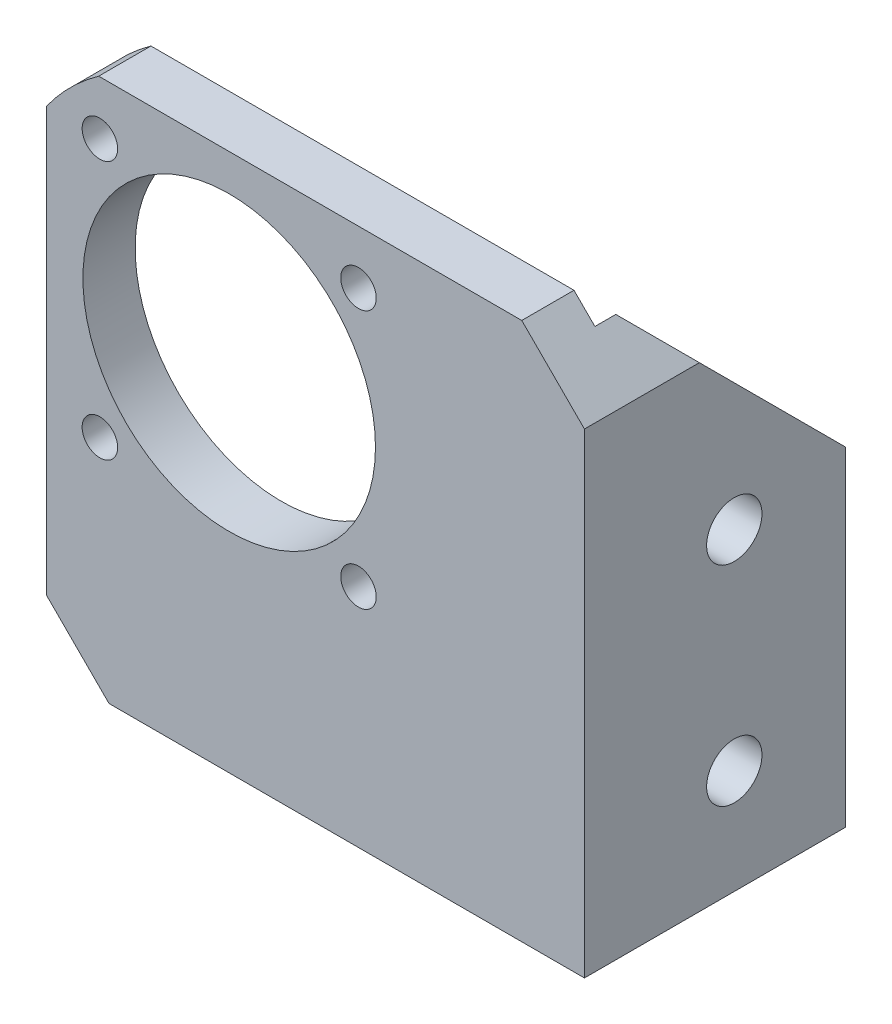
ISO-10303-21;
HEADER;
FILE_DESCRIPTION(('STEP AP214'),'2;1');
FILE_NAME('part.step','',(''),(''),'','','');
FILE_SCHEMA(('AUTOMOTIVE_DESIGN { 1 0 10303 214 1 1 1 1 }'));
ENDSEC;
DATA;
#1=APPLICATION_CONTEXT('core data for automotive mechanical design processes');
#2=APPLICATION_PROTOCOL_DEFINITION('international standard','automotive_design',2000,#1);
#3=PRODUCT_CONTEXT('',#1,'mechanical');
#4=PRODUCT('Part','Part','',(#3));
#5=PRODUCT_RELATED_PRODUCT_CATEGORY('part','',(#4));
#6=PRODUCT_DEFINITION_FORMATION('','',#4);
#7=PRODUCT_DEFINITION_CONTEXT('part definition',#1,'design');
#8=PRODUCT_DEFINITION('design','',#6,#7);
#9=PRODUCT_DEFINITION_SHAPE('','',#8);
#10=(LENGTH_UNIT() NAMED_UNIT(*) SI_UNIT(.MILLI.,.METRE.));
#11=(NAMED_UNIT(*) PLANE_ANGLE_UNIT() SI_UNIT($,.RADIAN.));
#12=(NAMED_UNIT(*) SI_UNIT($,.STERADIAN.) SOLID_ANGLE_UNIT());
#13=UNCERTAINTY_MEASURE_WITH_UNIT(LENGTH_MEASURE(1.E-05),#10,'distance_accuracy_value','');
#14=(GEOMETRIC_REPRESENTATION_CONTEXT(3) GLOBAL_UNCERTAINTY_ASSIGNED_CONTEXT((#13)) GLOBAL_UNIT_ASSIGNED_CONTEXT((#10,
#11,#12)) REPRESENTATION_CONTEXT('',''));
#15=CARTESIAN_POINT('',(0.,0.,0.));
#16=DIRECTION('',(0.,0.,1.));
#17=DIRECTION('',(1.,0.,0.));
#18=AXIS2_PLACEMENT_3D('',#15,#16,#17);
#19=CARTESIAN_POINT('',(0.,0.,0.));
#20=DIRECTION('',(0.,0.,1.));
#21=DIRECTION('',(1.,0.,0.));
#22=AXIS2_PLACEMENT_3D('',#19,#20,#21);
#23=PLANE('',#22);
#24=CARTESIAN_POINT('',(-12.374368670765,12.374368670765,0.));
#25=DIRECTION('',(0.,0.,1.));
#26=DIRECTION('',(1.,0.,0.));
#27=AXIS2_PLACEMENT_3D('',#24,#25,#26);
#28=CIRCLE('',#27,1.70000000000001);
#29=CARTESIAN_POINT('',(-10.674368670765,12.374368670765,0.));
#30=VERTEX_POINT('',#29);
#31=EDGE_CURVE('E142',#30,#30,#28,.T.);
#32=ORIENTED_EDGE('',*,*,#31,.T.);
#33=EDGE_LOOP('',(#32));
#34=FACE_BOUND('',#33,.T.);
#35=CARTESIAN_POINT('',(12.374368670765,12.374368670765,0.));
#36=DIRECTION('',(0.,0.,1.));
#37=DIRECTION('',(1.,0.,0.));
#38=AXIS2_PLACEMENT_3D('',#35,#36,#37);
#39=CIRCLE('',#38,1.70000000000001);
#40=CARTESIAN_POINT('',(14.074368670765,12.374368670765,0.));
#41=VERTEX_POINT('',#40);
#42=EDGE_CURVE('E167',#41,#41,#39,.T.);
#43=ORIENTED_EDGE('',*,*,#42,.T.);
#44=EDGE_LOOP('',(#43));
#45=FACE_BOUND('',#44,.T.);
#46=CARTESIAN_POINT('',(12.374368670765,-12.374368670765,0.));
#47=DIRECTION('',(0.,0.,1.));
#48=DIRECTION('',(1.,0.,0.));
#49=AXIS2_PLACEMENT_3D('',#46,#47,#48);
#50=CIRCLE('',#49,1.70000000000001);
#51=CARTESIAN_POINT('',(14.074368670765,-12.374368670765,0.));
#52=VERTEX_POINT('',#51);
#53=EDGE_CURVE('E173',#52,#52,#50,.T.);
#54=ORIENTED_EDGE('',*,*,#53,.T.);
#55=EDGE_LOOP('',(#54));
#56=FACE_BOUND('',#55,.T.);
#57=CARTESIAN_POINT('',(-12.374368670765,-12.374368670765,0.));
#58=DIRECTION('',(0.,0.,1.));
#59=DIRECTION('',(1.,0.,0.));
#60=AXIS2_PLACEMENT_3D('',#57,#58,#59);
#61=CIRCLE('',#60,1.70000000000001);
#62=CARTESIAN_POINT('',(-10.674368670765,-12.374368670765,0.));
#63=VERTEX_POINT('',#62);
#64=EDGE_CURVE('E179',#63,#63,#61,.T.);
#65=ORIENTED_EDGE('',*,*,#64,.T.);
#66=EDGE_LOOP('',(#65));
#67=FACE_BOUND('',#66,.T.);
#68=CARTESIAN_POINT('',(0.,0.,0.));
#69=DIRECTION('',(0.,0.,1.));
#70=DIRECTION('',(1.,0.,0.));
#71=AXIS2_PLACEMENT_3D('',#68,#69,#70);
#72=CIRCLE('',#71,14.);
#73=CARTESIAN_POINT('',(14.,0.,0.));
#74=VERTEX_POINT('',#73);
#75=EDGE_CURVE('E185',#74,#74,#72,.T.);
#76=ORIENTED_EDGE('',*,*,#75,.T.);
#77=EDGE_LOOP('',(#76));
#78=FACE_BOUND('',#77,.T.);
#79=DIRECTION('',(1.,0.,0.));
#80=VECTOR('',#79,1.);
#81=CARTESIAN_POINT('',(-17.5,-30.,0.));
#82=LINE('',#81,#80);
#83=CARTESIAN_POINT('',(-15.5,-30.,0.));
#84=VERTEX_POINT('',#83);
#85=CARTESIAN_POINT('',(30.0000000000018,-30.,0.));
#86=VERTEX_POINT('',#85);
#87=EDGE_CURVE('E155',#84,#86,#82,.T.);
#88=ORIENTED_EDGE('',*,*,#87,.F.);
#89=DIRECTION('',(-0.707106781186552,0.707106781186543,0.));
#90=VECTOR('',#89,1.);
#91=CARTESIAN_POINT('',(-17.5,-28.,0.));
#92=LINE('',#91,#90);
#93=CARTESIAN_POINT('',(-17.5,-28.,0.));
#94=VERTEX_POINT('',#93);
#95=EDGE_CURVE('E239',#84,#94,#92,.T.);
#96=ORIENTED_EDGE('',*,*,#95,.T.);
#97=DIRECTION('',(0.,-1.,0.));
#98=VECTOR('',#97,1.);
#99=CARTESIAN_POINT('',(-17.5,12.4899959967968,0.));
#100=LINE('',#99,#98);
#101=CARTESIAN_POINT('',(-17.5,12.4899959967968,0.));
#102=VERTEX_POINT('',#101);
#103=EDGE_CURVE('E197',#102,#94,#100,.T.);
#104=ORIENTED_EDGE('',*,*,#103,.F.);
#105=CARTESIAN_POINT('',(0.,0.,0.));
#106=DIRECTION('',(0.,0.,1.));
#107=DIRECTION('',(1.,0.,0.));
#108=AXIS2_PLACEMENT_3D('',#105,#106,#107);
#109=CIRCLE('',#108,21.5);
#110=CARTESIAN_POINT('',(-12.4899959967968,17.5,0.));
#111=VERTEX_POINT('',#110);
#112=EDGE_CURVE('E204',#111,#102,#109,.T.);
#113=ORIENTED_EDGE('',*,*,#112,.F.);
#114=DIRECTION('',(-1.,0.,0.));
#115=VECTOR('',#114,1.);
#116=CARTESIAN_POINT('',(12.4899959967968,17.5,0.));
#117=LINE('',#116,#115);
#118=CARTESIAN_POINT('',(28.0000000000018,17.5,0.));
#119=VERTEX_POINT('',#118);
#120=EDGE_CURVE('E191',#119,#111,#117,.T.);
#121=ORIENTED_EDGE('',*,*,#120,.F.);
#122=DIRECTION('',(0.707106781186549,-0.707106781186546,0.));
#123=VECTOR('',#122,1.);
#124=CARTESIAN_POINT('',(34.0000000000018,11.5,0.));
#125=LINE('',#124,#123);
#126=CARTESIAN_POINT('',(30.0000000000018,15.5,0.));
#127=VERTEX_POINT('',#126);
#128=EDGE_CURVE('E237',#119,#127,#125,.T.);
#129=ORIENTED_EDGE('',*,*,#128,.T.);
#130=DIRECTION('',(0.,1.,0.));
#131=VECTOR('',#130,1.);
#132=CARTESIAN_POINT('',(30.0000000000018,-30.,0.));
#133=LINE('',#132,#131);
#134=EDGE_CURVE('E131',#86,#127,#133,.T.);
#135=ORIENTED_EDGE('',*,*,#134,.F.);
#136=EDGE_LOOP('',(#88,#96,#104,#113,#121,#129,#135));
#137=FACE_BOUND('',#136,.T.);
#138=ADVANCED_FACE('F32',(#34,#45,#56,#67,#78,#137),#23,.F.);
#139=CARTESIAN_POINT('',(0.,0.,5.));
#140=DIRECTION('',(0.,0.,1.));
#141=DIRECTION('',(1.,0.,0.));
#142=AXIS2_PLACEMENT_3D('',#139,#140,#141);
#143=PLANE('',#142);
#144=DIRECTION('',(0.,-1.,0.));
#145=VECTOR('',#144,1.);
#146=CARTESIAN_POINT('',(-17.5,12.4899959967968,5.));
#147=LINE('',#146,#145);
#148=CARTESIAN_POINT('',(-17.5,12.4899959967968,5.));
#149=VERTEX_POINT('',#148);
#150=CARTESIAN_POINT('',(-17.5,-28.,5.));
#151=VERTEX_POINT('',#150);
#152=EDGE_CURVE('E199',#149,#151,#147,.T.);
#153=ORIENTED_EDGE('',*,*,#152,.T.);
#154=DIRECTION('',(0.707106781186552,-0.707106781186543,0.));
#155=VECTOR('',#154,1.);
#156=CARTESIAN_POINT('',(-22.7499999999999,-22.7500000000002,5.));
#157=LINE('',#156,#155);
#158=CARTESIAN_POINT('',(-11.5,-34.,5.));
#159=VERTEX_POINT('',#158);
#160=EDGE_CURVE('E229',#151,#159,#157,.T.);
#161=ORIENTED_EDGE('',*,*,#160,.T.);
#162=DIRECTION('',(1.,0.,0.));
#163=VECTOR('',#162,1.);
#164=CARTESIAN_POINT('',(-17.5,-34.,5.));
#165=LINE('',#164,#163);
#166=CARTESIAN_POINT('',(34.0000000000018,-33.9999999999998,5.));
#167=VERTEX_POINT('',#166);
#168=EDGE_CURVE('E161',#159,#167,#165,.T.);
#169=ORIENTED_EDGE('',*,*,#168,.T.);
#170=DIRECTION('',(0.,1.,0.));
#171=VECTOR('',#170,1.);
#172=CARTESIAN_POINT('',(34.0000000000018,-33.9999999999998,5.));
#173=LINE('',#172,#171);
#174=CARTESIAN_POINT('',(34.0000000000018,11.5,5.));
#175=VERTEX_POINT('',#174);
#176=EDGE_CURVE('E139',#167,#175,#173,.T.);
#177=ORIENTED_EDGE('',*,*,#176,.T.);
#178=DIRECTION('',(-0.707106781186549,0.707106781186546,0.));
#179=VECTOR('',#178,1.);
#180=CARTESIAN_POINT('',(22.7500000000009,22.7500000000009,5.));
#181=LINE('',#180,#179);
#182=CARTESIAN_POINT('',(28.0000000000018,17.5,5.));
#183=VERTEX_POINT('',#182);
#184=EDGE_CURVE('E227',#175,#183,#181,.T.);
#185=ORIENTED_EDGE('',*,*,#184,.T.);
#186=DIRECTION('',(-1.,0.,0.));
#187=VECTOR('',#186,1.);
#188=CARTESIAN_POINT('',(12.4899959967968,17.5,5.));
#189=LINE('',#188,#187);
#190=CARTESIAN_POINT('',(-12.4899959967968,17.5,5.));
#191=VERTEX_POINT('',#190);
#192=EDGE_CURVE('E194',#183,#191,#189,.T.);
#193=ORIENTED_EDGE('',*,*,#192,.T.);
#194=CARTESIAN_POINT('',(0.,0.,5.));
#195=DIRECTION('',(0.,0.,1.));
#196=DIRECTION('',(1.,0.,0.));
#197=AXIS2_PLACEMENT_3D('',#194,#195,#196);
#198=CIRCLE('',#197,21.5);
#199=EDGE_CURVE('E196',#191,#149,#198,.T.);
#200=ORIENTED_EDGE('',*,*,#199,.T.);
#201=EDGE_LOOP('',(#153,#161,#169,#177,#185,#193,#200));
#202=FACE_BOUND('',#201,.T.);
#203=CARTESIAN_POINT('',(12.374368670765,12.374368670765,5.));
#204=DIRECTION('',(0.,0.,1.));
#205=DIRECTION('',(1.,0.,0.));
#206=AXIS2_PLACEMENT_3D('',#203,#204,#205);
#207=CIRCLE('',#206,1.70000000000001);
#208=CARTESIAN_POINT('',(14.074368670765,12.374368670765,5.));
#209=VERTEX_POINT('',#208);
#210=EDGE_CURVE('E170',#209,#209,#207,.T.);
#211=ORIENTED_EDGE('',*,*,#210,.F.);
#212=EDGE_LOOP('',(#211));
#213=FACE_BOUND('',#212,.T.);
#214=CARTESIAN_POINT('',(-12.374368670765,-12.374368670765,5.));
#215=DIRECTION('',(0.,0.,1.));
#216=DIRECTION('',(1.,0.,0.));
#217=AXIS2_PLACEMENT_3D('',#214,#215,#216);
#218=CIRCLE('',#217,1.70000000000001);
#219=CARTESIAN_POINT('',(-10.674368670765,-12.374368670765,5.));
#220=VERTEX_POINT('',#219);
#221=EDGE_CURVE('E182',#220,#220,#218,.T.);
#222=ORIENTED_EDGE('',*,*,#221,.F.);
#223=EDGE_LOOP('',(#222));
#224=FACE_BOUND('',#223,.T.);
#225=CARTESIAN_POINT('',(0.,0.,5.));
#226=DIRECTION('',(0.,0.,1.));
#227=DIRECTION('',(1.,0.,0.));
#228=AXIS2_PLACEMENT_3D('',#225,#226,#227);
#229=CIRCLE('',#228,14.);
#230=CARTESIAN_POINT('',(14.,0.,5.));
#231=VERTEX_POINT('',#230);
#232=EDGE_CURVE('E188',#231,#231,#229,.T.);
#233=ORIENTED_EDGE('',*,*,#232,.F.);
#234=EDGE_LOOP('',(#233));
#235=FACE_BOUND('',#234,.T.);
#236=CARTESIAN_POINT('',(12.374368670765,-12.374368670765,5.));
#237=DIRECTION('',(0.,0.,1.));
#238=DIRECTION('',(1.,0.,0.));
#239=AXIS2_PLACEMENT_3D('',#236,#237,#238);
#240=CIRCLE('',#239,1.70000000000001);
#241=CARTESIAN_POINT('',(14.074368670765,-12.374368670765,5.));
#242=VERTEX_POINT('',#241);
#243=EDGE_CURVE('E176',#242,#242,#240,.T.);
#244=ORIENTED_EDGE('',*,*,#243,.F.);
#245=EDGE_LOOP('',(#244));
#246=FACE_BOUND('',#245,.T.);
#247=CARTESIAN_POINT('',(-12.374368670765,12.374368670765,5.));
#248=DIRECTION('',(0.,0.,1.));
#249=DIRECTION('',(1.,0.,0.));
#250=AXIS2_PLACEMENT_3D('',#247,#248,#249);
#251=CIRCLE('',#250,1.70000000000001);
#252=CARTESIAN_POINT('',(-10.674368670765,12.374368670765,5.));
#253=VERTEX_POINT('',#252);
#254=EDGE_CURVE('E164',#253,#253,#251,.T.);
#255=ORIENTED_EDGE('',*,*,#254,.F.);
#256=EDGE_LOOP('',(#255));
#257=FACE_BOUND('',#256,.T.);
#258=ADVANCED_FACE('F259',(#202,#213,#224,#235,#246,#257),#143,.T.);
#259=CARTESIAN_POINT('',(12.4899959967968,17.5,5.));
#260=DIRECTION('',(0.,-1.,0.));
#261=DIRECTION('',(1.,0.,0.));
#262=AXIS2_PLACEMENT_3D('',#259,#260,#261);
#263=PLANE('',#262);
#264=ORIENTED_EDGE('',*,*,#192,.F.);
#265=DIRECTION('',(0.,0.,-1.));
#266=VECTOR('',#265,1.);
#267=CARTESIAN_POINT('',(28.0000000000018,17.5,0.));
#268=LINE('',#267,#266);
#269=EDGE_CURVE('E243',#183,#119,#268,.T.);
#270=ORIENTED_EDGE('',*,*,#269,.T.);
#271=ORIENTED_EDGE('',*,*,#120,.T.);
#272=DIRECTION('',(0.,0.,-1.));
#273=VECTOR('',#272,1.);
#274=CARTESIAN_POINT('',(-12.4899959967968,17.5,5.));
#275=LINE('',#274,#273);
#276=EDGE_CURVE('E210',#191,#111,#275,.T.);
#277=ORIENTED_EDGE('',*,*,#276,.F.);
#278=EDGE_LOOP('',(#264,#270,#271,#277));
#279=FACE_BOUND('',#278,.T.);
#280=ADVANCED_FACE('F248',(#279),#263,.F.);
#281=CARTESIAN_POINT('',(0.,0.,5.));
#282=DIRECTION('',(0.,0.,-1.));
#283=DIRECTION('',(-1.,0.,0.));
#284=AXIS2_PLACEMENT_3D('',#281,#282,#283);
#285=CYLINDRICAL_SURFACE('',#284,21.5);
#286=ORIENTED_EDGE('',*,*,#112,.T.);
#287=DIRECTION('',(0.,0.,-1.));
#288=VECTOR('',#287,1.);
#289=CARTESIAN_POINT('',(-17.5,12.4899959967968,5.));
#290=LINE('',#289,#288);
#291=EDGE_CURVE('E202',#149,#102,#290,.T.);
#292=ORIENTED_EDGE('',*,*,#291,.F.);
#293=ORIENTED_EDGE('',*,*,#199,.F.);
#294=ORIENTED_EDGE('',*,*,#276,.T.);
#295=EDGE_LOOP('',(#286,#292,#293,#294));
#296=FACE_BOUND('',#295,.T.);
#297=ADVANCED_FACE('F303',(#296),#285,.T.);
#298=CARTESIAN_POINT('',(-17.5,12.4899959967968,5.));
#299=DIRECTION('',(1.,0.,0.));
#300=DIRECTION('',(0.,1.,0.));
#301=AXIS2_PLACEMENT_3D('',#298,#299,#300);
#302=PLANE('',#301);
#303=ORIENTED_EDGE('',*,*,#103,.T.);
#304=DIRECTION('',(0.,0.,1.));
#305=VECTOR('',#304,1.);
#306=CARTESIAN_POINT('',(-17.5,-28.,5.));
#307=LINE('',#306,#305);
#308=EDGE_CURVE('E224',#94,#151,#307,.T.);
#309=ORIENTED_EDGE('',*,*,#308,.T.);
#310=ORIENTED_EDGE('',*,*,#152,.F.);
#311=ORIENTED_EDGE('',*,*,#291,.T.);
#312=EDGE_LOOP('',(#303,#309,#310,#311));
#313=FACE_BOUND('',#312,.T.);
#314=ADVANCED_FACE('F299',(#313),#302,.F.);
#315=CARTESIAN_POINT('',(0.,0.,5.));
#316=DIRECTION('',(0.,0.,-1.));
#317=DIRECTION('',(-1.,0.,0.));
#318=AXIS2_PLACEMENT_3D('',#315,#316,#317);
#319=CYLINDRICAL_SURFACE('',#318,14.);
#320=ORIENTED_EDGE('',*,*,#232,.T.);
#321=EDGE_LOOP('',(#320));
#322=FACE_BOUND('',#321,.T.);
#323=ORIENTED_EDGE('',*,*,#75,.F.);
#324=EDGE_LOOP('',(#323));
#325=FACE_BOUND('',#324,.T.);
#326=ADVANCED_FACE('F302',(#322,#325),#319,.F.);
#327=CARTESIAN_POINT('',(-12.374368670765,-12.374368670765,5.));
#328=DIRECTION('',(0.,0.,-1.));
#329=DIRECTION('',(-1.,0.,0.));
#330=AXIS2_PLACEMENT_3D('',#327,#328,#329);
#331=CYLINDRICAL_SURFACE('',#330,1.70000000000001);
#332=ORIENTED_EDGE('',*,*,#221,.T.);
#333=EDGE_LOOP('',(#332));
#334=FACE_BOUND('',#333,.T.);
#335=ORIENTED_EDGE('',*,*,#64,.F.);
#336=EDGE_LOOP('',(#335));
#337=FACE_BOUND('',#336,.T.);
#338=ADVANCED_FACE('F389',(#334,#337),#331,.F.);
#339=CARTESIAN_POINT('',(12.374368670765,-12.374368670765,5.));
#340=DIRECTION('',(0.,0.,-1.));
#341=DIRECTION('',(-1.,0.,0.));
#342=AXIS2_PLACEMENT_3D('',#339,#340,#341);
#343=CYLINDRICAL_SURFACE('',#342,1.70000000000001);
#344=ORIENTED_EDGE('',*,*,#243,.T.);
#345=EDGE_LOOP('',(#344));
#346=FACE_BOUND('',#345,.T.);
#347=ORIENTED_EDGE('',*,*,#53,.F.);
#348=EDGE_LOOP('',(#347));
#349=FACE_BOUND('',#348,.T.);
#350=ADVANCED_FACE('F385',(#346,#349),#343,.F.);
#351=CARTESIAN_POINT('',(12.374368670765,12.374368670765,5.));
#352=DIRECTION('',(0.,0.,-1.));
#353=DIRECTION('',(-1.,0.,0.));
#354=AXIS2_PLACEMENT_3D('',#351,#352,#353);
#355=CYLINDRICAL_SURFACE('',#354,1.70000000000001);
#356=ORIENTED_EDGE('',*,*,#210,.T.);
#357=EDGE_LOOP('',(#356));
#358=FACE_BOUND('',#357,.T.);
#359=ORIENTED_EDGE('',*,*,#42,.F.);
#360=EDGE_LOOP('',(#359));
#361=FACE_BOUND('',#360,.T.);
#362=ADVANCED_FACE('F379',(#358,#361),#355,.F.);
#363=CARTESIAN_POINT('',(-12.374368670765,12.374368670765,5.));
#364=DIRECTION('',(0.,0.,-1.));
#365=DIRECTION('',(-1.,0.,0.));
#366=AXIS2_PLACEMENT_3D('',#363,#364,#365);
#367=CYLINDRICAL_SURFACE('',#366,1.70000000000001);
#368=ORIENTED_EDGE('',*,*,#254,.T.);
#369=EDGE_LOOP('',(#368));
#370=FACE_BOUND('',#369,.T.);
#371=ORIENTED_EDGE('',*,*,#31,.F.);
#372=EDGE_LOOP('',(#371));
#373=FACE_BOUND('',#372,.T.);
#374=ADVANCED_FACE('F370',(#370,#373),#367,.F.);
#375=CARTESIAN_POINT('',(34.0000000000018,-33.9999999999998,0.));
#376=DIRECTION('',(1.,0.,0.));
#377=DIRECTION('',(0.,1.,0.));
#378=AXIS2_PLACEMENT_3D('',#375,#376,#377);
#379=PLANE('',#378);
#380=CARTESIAN_POINT('',(34.0000000000018,-4.00000000000003,-9.34000000000244));
#381=DIRECTION('',(1.,0.,0.));
#382=DIRECTION('',(0.,1.,0.));
#383=AXIS2_PLACEMENT_3D('',#380,#381,#382);
#384=CIRCLE('',#383,2.64999999999999);
#385=CARTESIAN_POINT('',(34.0000000000018,-1.35000000000005,-9.34000000000244));
#386=VERTEX_POINT('',#385);
#387=EDGE_CURVE('E157',#386,#386,#384,.T.);
#388=ORIENTED_EDGE('',*,*,#387,.F.);
#389=EDGE_LOOP('',(#388));
#390=FACE_BOUND('',#389,.T.);
#391=CARTESIAN_POINT('',(34.0000000000018,-24.,-9.34000000000244));
#392=DIRECTION('',(1.,0.,0.));
#393=DIRECTION('',(0.,1.,0.));
#394=AXIS2_PLACEMENT_3D('',#391,#392,#393);
#395=CIRCLE('',#394,2.64999999999999);
#396=CARTESIAN_POINT('',(34.0000000000018,-21.35,-9.34000000000244));
#397=VERTEX_POINT('',#396);
#398=EDGE_CURVE('E361',#397,#397,#395,.T.);
#399=ORIENTED_EDGE('',*,*,#398,.F.);
#400=EDGE_LOOP('',(#399));
#401=FACE_BOUND('',#400,.T.);
#402=DIRECTION('',(0.,0.707106781186547,0.707106781186548));
#403=VECTOR('',#402,1.);
#404=CARTESIAN_POINT('',(34.0000000000018,-8.24999999999985,-25.7499999999999));
#405=LINE('',#404,#403);
#406=CARTESIAN_POINT('',(34.0000000000018,-2.5,-20.));
#407=VERTEX_POINT('',#406);
#408=CARTESIAN_POINT('',(34.0000000000018,11.5,-5.99999999999995));
#409=VERTEX_POINT('',#408);
#410=EDGE_CURVE('E216',#407,#409,#405,.T.);
#411=ORIENTED_EDGE('',*,*,#410,.T.);
#412=DIRECTION('',(0.,0.,1.));
#413=VECTOR('',#412,1.);
#414=CARTESIAN_POINT('',(34.0000000000018,11.5,5.));
#415=LINE('',#414,#413);
#416=EDGE_CURVE('E241',#409,#175,#415,.T.);
#417=ORIENTED_EDGE('',*,*,#416,.T.);
#418=ORIENTED_EDGE('',*,*,#176,.F.);
#419=DIRECTION('',(0.,0.,1.));
#420=VECTOR('',#419,1.);
#421=CARTESIAN_POINT('',(34.0000000000018,-33.9999999999998,0.));
#422=LINE('',#421,#420);
#423=CARTESIAN_POINT('',(34.0000000000018,-34.,-20.));
#424=VERTEX_POINT('',#423);
#425=EDGE_CURVE('E135',#424,#167,#422,.T.);
#426=ORIENTED_EDGE('',*,*,#425,.F.);
#427=DIRECTION('',(0.,-1.,0.));
#428=VECTOR('',#427,1.);
#429=CARTESIAN_POINT('',(34.0000000000018,17.5,-20.));
#430=LINE('',#429,#428);
#431=EDGE_CURVE('E120',#407,#424,#430,.T.);
#432=ORIENTED_EDGE('',*,*,#431,.F.);
#433=EDGE_LOOP('',(#411,#417,#418,#426,#432));
#434=FACE_BOUND('',#433,.T.);
#435=ADVANCED_FACE('F136',(#390,#401,#434),#379,.T.);
#436=CARTESIAN_POINT('',(-17.5,-34.,0.));
#437=DIRECTION('',(0.,-1.,0.));
#438=DIRECTION('',(1.,0.,0.));
#439=AXIS2_PLACEMENT_3D('',#436,#437,#438);
#440=PLANE('',#439);
#441=CARTESIAN_POINT('',(1.00000000000211,-33.9999999999999,-9.34000000000244));
#442=DIRECTION('',(0.,-1.,0.));
#443=DIRECTION('',(1.,0.,0.));
#444=AXIS2_PLACEMENT_3D('',#441,#442,#443);
#445=CIRCLE('',#444,2.64999999999999);
#446=CARTESIAN_POINT('',(3.65000000000209,-33.9999999999999,-9.34000000000244));
#447=VERTEX_POINT('',#446);
#448=EDGE_CURVE('E344',#447,#447,#445,.T.);
#449=ORIENTED_EDGE('',*,*,#448,.F.);
#450=EDGE_LOOP('',(#449));
#451=FACE_BOUND('',#450,.T.);
#452=CARTESIAN_POINT('',(21.0000000000021,-33.9999999999998,-9.34000000000244));
#453=DIRECTION('',(0.,-1.,0.));
#454=DIRECTION('',(1.,0.,0.));
#455=AXIS2_PLACEMENT_3D('',#452,#453,#454);
#456=CIRCLE('',#455,2.64999999999999);
#457=CARTESIAN_POINT('',(23.6500000000021,-33.9999999999998,-9.34000000000244));
#458=VERTEX_POINT('',#457);
#459=EDGE_CURVE('E348',#458,#458,#456,.T.);
#460=ORIENTED_EDGE('',*,*,#459,.F.);
#461=EDGE_LOOP('',(#460));
#462=FACE_BOUND('',#461,.T.);
#463=ORIENTED_EDGE('',*,*,#168,.F.);
#464=DIRECTION('',(0.,0.,-1.));
#465=VECTOR('',#464,1.);
#466=CARTESIAN_POINT('',(-11.5,-34.,-0.149894642354647));
#467=LINE('',#466,#465);
#468=CARTESIAN_POINT('',(-11.5,-34.,-6.14568033660988));
#469=VERTEX_POINT('',#468);
#470=EDGE_CURVE('E231',#159,#469,#467,.T.);
#471=ORIENTED_EDGE('',*,*,#470,.T.);
#472=DIRECTION('',(0.707355155124562,0.,-0.706858319975585));
#473=VECTOR('',#472,1.);
#474=CARTESIAN_POINT('',(-17.5749473026769,-34.,-0.0749999814857492));
#475=LINE('',#474,#473);
#476=CARTESIAN_POINT('',(2.36405755962681,-34.,-20.));
#477=VERTEX_POINT('',#476);
#478=EDGE_CURVE('E146',#469,#477,#475,.T.);
#479=ORIENTED_EDGE('',*,*,#478,.T.);
#480=DIRECTION('',(-1.,0.,0.));
#481=VECTOR('',#480,1.);
#482=CARTESIAN_POINT('',(34.0000000000018,-34.,-20.));
#483=LINE('',#482,#481);
#484=EDGE_CURVE('E126',#424,#477,#483,.T.);
#485=ORIENTED_EDGE('',*,*,#484,.F.);
#486=ORIENTED_EDGE('',*,*,#425,.T.);
#487=EDGE_LOOP('',(#463,#471,#479,#485,#486));
#488=FACE_BOUND('',#487,.T.);
#489=ADVANCED_FACE('F144',(#451,#462,#488),#440,.T.);
#490=CARTESIAN_POINT('',(-17.5,-30.,-20.));
#491=DIRECTION('',(0.,-1.,0.));
#492=DIRECTION('',(1.,0.,0.));
#493=AXIS2_PLACEMENT_3D('',#490,#491,#492);
#494=PLANE('',#493);
#495=CARTESIAN_POINT('',(1.00000000000211,-30.,-9.34000000000244));
#496=DIRECTION('',(0.,1.,0.));
#497=DIRECTION('',(-1.,0.,0.));
#498=AXIS2_PLACEMENT_3D('',#495,#496,#497);
#499=CIRCLE('',#498,2.64999999999999);
#500=CARTESIAN_POINT('',(-1.64999999999788,-30.,-9.34000000000244));
#501=VERTEX_POINT('',#500);
#502=EDGE_CURVE('E347',#501,#501,#499,.T.);
#503=ORIENTED_EDGE('',*,*,#502,.F.);
#504=EDGE_LOOP('',(#503));
#505=FACE_BOUND('',#504,.T.);
#506=CARTESIAN_POINT('',(21.0000000000021,-30.,-9.34000000000244));
#507=DIRECTION('',(0.,1.,0.));
#508=DIRECTION('',(-1.,0.,0.));
#509=AXIS2_PLACEMENT_3D('',#506,#507,#508);
#510=CIRCLE('',#509,2.64999999999999);
#511=CARTESIAN_POINT('',(18.3500000000021,-30.,-9.34000000000244));
#512=VERTEX_POINT('',#511);
#513=EDGE_CURVE('E349',#512,#512,#510,.T.);
#514=ORIENTED_EDGE('',*,*,#513,.F.);
#515=EDGE_LOOP('',(#514));
#516=FACE_BOUND('',#515,.T.);
#517=DIRECTION('',(-0.707355155124562,0.,0.706858319975586));
#518=VECTOR('',#517,1.);
#519=CARTESIAN_POINT('',(3.07439587501932,-30.,-20.5599447425639));
#520=LINE('',#519,#518);
#521=CARTESIAN_POINT('',(2.51405755962514,-30.,-20.));
#522=VERTEX_POINT('',#521);
#523=CARTESIAN_POINT('',(-15.5,-30.,-1.9985952314183));
#524=VERTEX_POINT('',#523);
#525=EDGE_CURVE('E220',#522,#524,#520,.T.);
#526=ORIENTED_EDGE('',*,*,#525,.T.);
#527=DIRECTION('',(0.,0.,1.));
#528=VECTOR('',#527,1.);
#529=CARTESIAN_POINT('',(-15.5,-30.,5.));
#530=LINE('',#529,#528);
#531=EDGE_CURVE('E235',#524,#84,#530,.T.);
#532=ORIENTED_EDGE('',*,*,#531,.T.);
#533=ORIENTED_EDGE('',*,*,#87,.T.);
#534=DIRECTION('',(0.,0.,1.));
#535=VECTOR('',#534,1.);
#536=CARTESIAN_POINT('',(30.0000000000018,-30.,-20.));
#537=LINE('',#536,#535);
#538=CARTESIAN_POINT('',(30.0000000000018,-30.,-20.));
#539=VERTEX_POINT('',#538);
#540=EDGE_CURVE('E154',#539,#86,#537,.T.);
#541=ORIENTED_EDGE('',*,*,#540,.F.);
#542=DIRECTION('',(1.,0.,0.));
#543=VECTOR('',#542,1.);
#544=CARTESIAN_POINT('',(-17.5,-30.,-20.));
#545=LINE('',#544,#543);
#546=EDGE_CURVE('E147',#522,#539,#545,.T.);
#547=ORIENTED_EDGE('',*,*,#546,.F.);
#548=EDGE_LOOP('',(#526,#532,#533,#541,#547));
#549=FACE_BOUND('',#548,.T.);
#550=ADVANCED_FACE('F272',(#505,#516,#549),#494,.F.);
#551=CARTESIAN_POINT('',(30.0000000000018,-30.,-20.));
#552=DIRECTION('',(1.,0.,0.));
#553=DIRECTION('',(0.,0.,-1.));
#554=AXIS2_PLACEMENT_3D('',#551,#552,#553);
#555=PLANE('',#554);
#556=CARTESIAN_POINT('',(30.0000000000018,-4.00000000000003,-9.34000000000244));
#557=DIRECTION('',(-1.,0.,0.));
#558=DIRECTION('',(0.,0.,1.));
#559=AXIS2_PLACEMENT_3D('',#556,#557,#558);
#560=CIRCLE('',#559,2.64999999999999);
#561=CARTESIAN_POINT('',(30.0000000000018,-4.00000000000003,-6.69000000000246));
#562=VERTEX_POINT('',#561);
#563=EDGE_CURVE('E358',#562,#562,#560,.T.);
#564=ORIENTED_EDGE('',*,*,#563,.F.);
#565=EDGE_LOOP('',(#564));
#566=FACE_BOUND('',#565,.T.);
#567=CARTESIAN_POINT('',(30.0000000000018,-24.,-9.34000000000244));
#568=DIRECTION('',(-1.,0.,0.));
#569=DIRECTION('',(0.,0.,1.));
#570=AXIS2_PLACEMENT_3D('',#567,#568,#569);
#571=CIRCLE('',#570,2.64999999999999);
#572=CARTESIAN_POINT('',(30.0000000000018,-24.,-6.69000000000246));
#573=VERTEX_POINT('',#572);
#574=EDGE_CURVE('E357',#573,#573,#571,.T.);
#575=ORIENTED_EDGE('',*,*,#574,.F.);
#576=EDGE_LOOP('',(#575));
#577=FACE_BOUND('',#576,.T.);
#578=ORIENTED_EDGE('',*,*,#134,.T.);
#579=DIRECTION('',(0.,0.,-1.));
#580=VECTOR('',#579,1.);
#581=CARTESIAN_POINT('',(30.0000000000018,15.5,0.));
#582=LINE('',#581,#580);
#583=CARTESIAN_POINT('',(30.0000000000018,15.5,-1.99999999999996));
#584=VERTEX_POINT('',#583);
#585=EDGE_CURVE('E40',#127,#584,#582,.T.);
#586=ORIENTED_EDGE('',*,*,#585,.T.);
#587=DIRECTION('',(0.,-0.707106781186547,-0.707106781186548));
#588=VECTOR('',#587,1.);
#589=CARTESIAN_POINT('',(30.0000000000018,-2.50000000000001,-20.));
#590=LINE('',#589,#588);
#591=CARTESIAN_POINT('',(30.0000000000018,-2.5,-20.));
#592=VERTEX_POINT('',#591);
#593=EDGE_CURVE('E218',#584,#592,#590,.T.);
#594=ORIENTED_EDGE('',*,*,#593,.T.);
#595=DIRECTION('',(0.,1.,0.));
#596=VECTOR('',#595,1.);
#597=CARTESIAN_POINT('',(30.0000000000018,-30.,-20.));
#598=LINE('',#597,#596);
#599=EDGE_CURVE('E149',#539,#592,#598,.T.);
#600=ORIENTED_EDGE('',*,*,#599,.F.);
#601=ORIENTED_EDGE('',*,*,#540,.T.);
#602=EDGE_LOOP('',(#578,#586,#594,#600,#601));
#603=FACE_BOUND('',#602,.T.);
#604=ADVANCED_FACE('F276',(#566,#577,#603),#555,.F.);
#605=CARTESIAN_POINT('',(0.,0.,-20.));
#606=DIRECTION('',(0.,0.,-1.));
#607=DIRECTION('',(-1.,0.,0.));
#608=AXIS2_PLACEMENT_3D('',#605,#606,#607);
#609=PLANE('',#608);
#610=ORIENTED_EDGE('',*,*,#599,.T.);
#611=DIRECTION('',(1.,0.,0.));
#612=VECTOR('',#611,1.);
#613=CARTESIAN_POINT('',(34.0000000000018,-2.5,-20.));
#614=LINE('',#613,#612);
#615=EDGE_CURVE('E129',#592,#407,#614,.T.);
#616=ORIENTED_EDGE('',*,*,#615,.T.);
#617=ORIENTED_EDGE('',*,*,#431,.T.);
#618=ORIENTED_EDGE('',*,*,#484,.T.);
#619=DIRECTION('',(0.0374736605886796,0.999297615709196,0.));
#620=VECTOR('',#619,1.);
#621=CARTESIAN_POINT('',(2.48595231418394,-30.7494732117736,-20.));
#622=LINE('',#621,#620);
#623=EDGE_CURVE('E213',#477,#522,#622,.T.);
#624=ORIENTED_EDGE('',*,*,#623,.T.);
#625=ORIENTED_EDGE('',*,*,#546,.T.);
#626=EDGE_LOOP('',(#610,#616,#617,#618,#624,#625));
#627=FACE_BOUND('',#626,.T.);
#628=ADVANCED_FACE('F123',(#627),#609,.T.);
#629=CARTESIAN_POINT('',(0.,-2.50000000000001,-20.));
#630=DIRECTION('',(0.,0.707106781186548,-0.707106781186547));
#631=DIRECTION('',(-1.,0.,0.));
#632=AXIS2_PLACEMENT_3D('',#629,#630,#631);
#633=PLANE('',#632);
#634=ORIENTED_EDGE('',*,*,#593,.F.);
#635=DIRECTION('',(0.577350269189627,-0.577350269189625,-0.577350269189626));
#636=VECTOR('',#635,1.);
#637=CARTESIAN_POINT('',(32.0000000000012,13.5000000000006,-3.99999999999934));
#638=LINE('',#637,#636);
#639=EDGE_CURVE('E11',#584,#409,#638,.T.);
#640=ORIENTED_EDGE('',*,*,#639,.T.);
#641=ORIENTED_EDGE('',*,*,#410,.F.);
#642=ORIENTED_EDGE('',*,*,#615,.F.);
#643=EDGE_LOOP('',(#634,#640,#641,#642));
#644=FACE_BOUND('',#643,.T.);
#645=ADVANCED_FACE('F275',(#644),#633,.T.);
#646=CARTESIAN_POINT('',(3.63394732119236,-0.136273024543203,-20.));
#647=DIRECTION('',(-0.706610120491522,0.0264978795181385,-0.707106781186546));
#648=DIRECTION('',(-0.0374736605886796,-0.999297615709196,0.));
#649=AXIS2_PLACEMENT_3D('',#646,#647,#648);
#650=PLANE('',#649);
#651=ORIENTED_EDGE('',*,*,#478,.F.);
#652=DIRECTION('',(-0.570275714743039,0.570275714743032,0.591245480615826));
#653=VECTOR('',#652,1.);
#654=CARTESIAN_POINT('',(-12.9198922011619,-32.5801077988381,-4.67357688700584));
#655=LINE('',#654,#653);
#656=EDGE_CURVE('E233',#469,#524,#655,.T.);
#657=ORIENTED_EDGE('',*,*,#656,.T.);
#658=ORIENTED_EDGE('',*,*,#525,.F.);
#659=ORIENTED_EDGE('',*,*,#623,.F.);
#660=EDGE_LOOP('',(#651,#657,#658,#659));
#661=FACE_BOUND('',#660,.T.);
#662=ADVANCED_FACE('F269',(#661),#650,.T.);
#663=CARTESIAN_POINT('',(-17.5,-28.,5.));
#664=DIRECTION('',(-0.707106781186543,-0.707106781186552,0.));
#665=DIRECTION('',(0.,0.,-1.));
#666=AXIS2_PLACEMENT_3D('',#663,#664,#665);
#667=PLANE('',#666);
#668=ORIENTED_EDGE('',*,*,#656,.F.);
#669=ORIENTED_EDGE('',*,*,#470,.F.);
#670=ORIENTED_EDGE('',*,*,#160,.F.);
#671=ORIENTED_EDGE('',*,*,#308,.F.);
#672=ORIENTED_EDGE('',*,*,#95,.F.);
#673=ORIENTED_EDGE('',*,*,#531,.F.);
#674=EDGE_LOOP('',(#668,#669,#670,#671,#672,#673));
#675=FACE_BOUND('',#674,.T.);
#676=ADVANCED_FACE('F264',(#675),#667,.T.);
#677=CARTESIAN_POINT('',(34.0000000000018,11.5,0.));
#678=DIRECTION('',(0.707106781186546,0.707106781186549,0.));
#679=DIRECTION('',(0.,0.,-1.));
#680=AXIS2_PLACEMENT_3D('',#677,#678,#679);
#681=PLANE('',#680);
#682=ORIENTED_EDGE('',*,*,#128,.F.);
#683=ORIENTED_EDGE('',*,*,#269,.F.);
#684=ORIENTED_EDGE('',*,*,#184,.F.);
#685=ORIENTED_EDGE('',*,*,#416,.F.);
#686=ORIENTED_EDGE('',*,*,#639,.F.);
#687=ORIENTED_EDGE('',*,*,#585,.F.);
#688=EDGE_LOOP('',(#682,#683,#684,#685,#686,#687));
#689=FACE_BOUND('',#688,.T.);
#690=ADVANCED_FACE('F34',(#689),#681,.T.);
#691=CARTESIAN_POINT('',(55.0000000000018,-24.,-9.34000000000244));
#692=DIRECTION('',(-1.,0.,0.));
#693=DIRECTION('',(0.,0.,1.));
#694=AXIS2_PLACEMENT_3D('',#691,#692,#693);
#695=CYLINDRICAL_SURFACE('',#694,2.64999999999999);
#696=ORIENTED_EDGE('',*,*,#398,.T.);
#697=EDGE_LOOP('',(#696));
#698=FACE_BOUND('',#697,.T.);
#699=ORIENTED_EDGE('',*,*,#574,.T.);
#700=EDGE_LOOP('',(#699));
#701=FACE_BOUND('',#700,.T.);
#702=ADVANCED_FACE('F317',(#698,#701),#695,.F.);
#703=CARTESIAN_POINT('',(55.0000000000018,-4.00000000000003,-9.34000000000244));
#704=DIRECTION('',(-1.,0.,0.));
#705=DIRECTION('',(0.,0.,1.));
#706=AXIS2_PLACEMENT_3D('',#703,#704,#705);
#707=CYLINDRICAL_SURFACE('',#706,2.64999999999999);
#708=ORIENTED_EDGE('',*,*,#387,.T.);
#709=EDGE_LOOP('',(#708));
#710=FACE_BOUND('',#709,.T.);
#711=ORIENTED_EDGE('',*,*,#563,.T.);
#712=EDGE_LOOP('',(#711));
#713=FACE_BOUND('',#712,.T.);
#714=ADVANCED_FACE('F321',(#710,#713),#707,.F.);
#715=CARTESIAN_POINT('',(21.0000000000021,-55.,-9.34000000000244));
#716=DIRECTION('',(0.,1.,0.));
#717=DIRECTION('',(-1.,0.,0.));
#718=AXIS2_PLACEMENT_3D('',#715,#716,#717);
#719=CYLINDRICAL_SURFACE('',#718,2.64999999999999);
#720=ORIENTED_EDGE('',*,*,#459,.T.);
#721=EDGE_LOOP('',(#720));
#722=FACE_BOUND('',#721,.T.);
#723=ORIENTED_EDGE('',*,*,#513,.T.);
#724=EDGE_LOOP('',(#723));
#725=FACE_BOUND('',#724,.T.);
#726=ADVANCED_FACE('F327',(#722,#725),#719,.F.);
#727=CARTESIAN_POINT('',(1.0000000000021,-55.,-9.34000000000244));
#728=DIRECTION('',(0.,1.,0.));
#729=DIRECTION('',(-1.,0.,0.));
#730=AXIS2_PLACEMENT_3D('',#727,#728,#729);
#731=CYLINDRICAL_SURFACE('',#730,2.64999999999999);
#732=ORIENTED_EDGE('',*,*,#448,.T.);
#733=EDGE_LOOP('',(#732));
#734=FACE_BOUND('',#733,.T.);
#735=ORIENTED_EDGE('',*,*,#502,.T.);
#736=EDGE_LOOP('',(#735));
#737=FACE_BOUND('',#736,.T.);
#738=ADVANCED_FACE('F335',(#734,#737),#731,.F.);
#739=CLOSED_SHELL('',(#138,#258,#280,#297,#314,#326,#338,#350,#362,#374,#435,#489,#550,#604,
#628,#645,#662,#676,#690,#702,#714,#726,#738));
#740=MANIFOLD_SOLID_BREP('B2',#739);
#741=ADVANCED_BREP_SHAPE_REPRESENTATION('',(#18,#740),#14);
#742=SHAPE_DEFINITION_REPRESENTATION(#9,#741);
ENDSEC;
END-ISO-10303-21;
